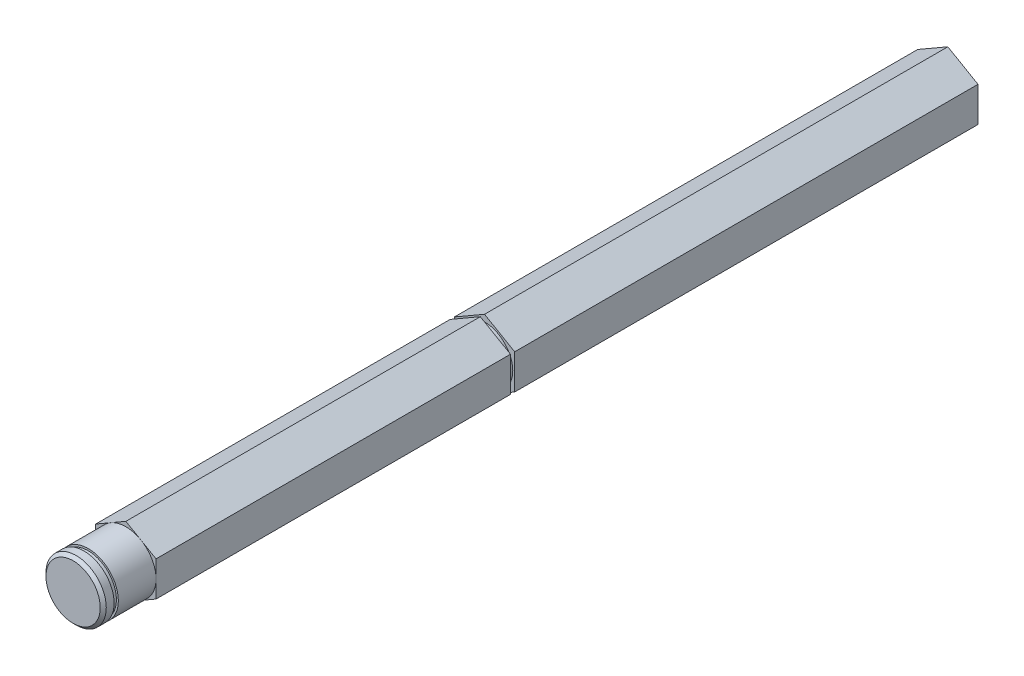
ISO-10303-21;
HEADER;
FILE_DESCRIPTION(('STEP AP214'),'2;1');
FILE_NAME('part.step','',(''),(''),'','','');
FILE_SCHEMA(('AUTOMOTIVE_DESIGN { 1 0 10303 214 1 1 1 1 }'));
ENDSEC;
DATA;
#1=APPLICATION_CONTEXT('core data for automotive mechanical design processes');
#2=APPLICATION_PROTOCOL_DEFINITION('international standard','automotive_design',2000,#1);
#3=PRODUCT_CONTEXT('',#1,'mechanical');
#4=PRODUCT('Part','Part','',(#3));
#5=PRODUCT_RELATED_PRODUCT_CATEGORY('part','',(#4));
#6=PRODUCT_DEFINITION_FORMATION('','',#4);
#7=PRODUCT_DEFINITION_CONTEXT('part definition',#1,'design');
#8=PRODUCT_DEFINITION('design','',#6,#7);
#9=PRODUCT_DEFINITION_SHAPE('','',#8);
#10=(LENGTH_UNIT() NAMED_UNIT(*) SI_UNIT(.MILLI.,.METRE.));
#11=(NAMED_UNIT(*) PLANE_ANGLE_UNIT() SI_UNIT($,.RADIAN.));
#12=(NAMED_UNIT(*) SI_UNIT($,.STERADIAN.) SOLID_ANGLE_UNIT());
#13=UNCERTAINTY_MEASURE_WITH_UNIT(LENGTH_MEASURE(1.E-05),#10,'distance_accuracy_value','');
#14=(GEOMETRIC_REPRESENTATION_CONTEXT(3) GLOBAL_UNCERTAINTY_ASSIGNED_CONTEXT((#13)) GLOBAL_UNIT_ASSIGNED_CONTEXT((#10,
#11,#12)) REPRESENTATION_CONTEXT('',''));
#15=CARTESIAN_POINT('',(0.,0.,0.));
#16=DIRECTION('',(0.,0.,1.));
#17=DIRECTION('',(1.,0.,0.));
#18=AXIS2_PLACEMENT_3D('',#15,#16,#17);
#19=CARTESIAN_POINT('',(6.35,3.66617420935412,184.15));
#20=DIRECTION('',(-0.5,-0.866025403784438,0.));
#21=DIRECTION('',(0.866025403784439,-0.5,0.));
#22=AXIS2_PLACEMENT_3D('',#19,#20,#21);
#23=PLANE('',#22);
#24=DIRECTION('',(-0.866025403784439,0.5,0.));
#25=VECTOR('',#24,1.);
#26=CARTESIAN_POINT('',(6.35,3.66617420935412,97.536));
#27=LINE('',#26,#25);
#28=CARTESIAN_POINT('',(6.35,3.66617420935412,97.536));
#29=VERTEX_POINT('',#28);
#30=CARTESIAN_POINT('',(0.,7.33234841870824,97.536));
#31=VERTEX_POINT('',#30);
#32=EDGE_CURVE('E142',#29,#31,#27,.T.);
#33=ORIENTED_EDGE('',*,*,#32,.F.);
#34=DIRECTION('',(0.,0.,-1.));
#35=VECTOR('',#34,1.);
#36=CARTESIAN_POINT('',(6.35,3.66617420935412,184.15));
#37=LINE('',#36,#35);
#38=CARTESIAN_POINT('',(6.35,3.66617420935412,0.));
#39=VERTEX_POINT('',#38);
#40=EDGE_CURVE('E153',#29,#39,#37,.T.);
#41=ORIENTED_EDGE('',*,*,#40,.T.);
#42=DIRECTION('',(-0.866025403784438,0.5,0.));
#43=VECTOR('',#42,1.);
#44=CARTESIAN_POINT('',(6.35,3.66617420935412,0.));
#45=LINE('',#44,#43);
#46=CARTESIAN_POINT('',(0.,7.33234841870824,0.));
#47=VERTEX_POINT('',#46);
#48=EDGE_CURVE('E254',#39,#47,#45,.T.);
#49=ORIENTED_EDGE('',*,*,#48,.T.);
#50=DIRECTION('',(0.,0.,-1.));
#51=VECTOR('',#50,1.);
#52=CARTESIAN_POINT('',(0.,7.33234841870824,184.15));
#53=LINE('',#52,#51);
#54=EDGE_CURVE('E155',#31,#47,#53,.T.);
#55=ORIENTED_EDGE('',*,*,#54,.F.);
#56=EDGE_LOOP('',(#33,#41,#49,#55));
#57=FACE_BOUND('',#56,.T.);
#58=ADVANCED_FACE('F35',(#57),#23,.F.);
#59=CARTESIAN_POINT('',(0.,7.33234841870824,184.15));
#60=DIRECTION('',(0.5,-0.866025403784439,0.));
#61=DIRECTION('',(0.866025403784439,0.5,0.));
#62=AXIS2_PLACEMENT_3D('',#59,#60,#61);
#63=PLANE('',#62);
#64=DIRECTION('',(-0.866025403784439,-0.5,0.));
#65=VECTOR('',#64,1.);
#66=CARTESIAN_POINT('',(0.,7.33234841870824,97.536));
#67=LINE('',#66,#65);
#68=CARTESIAN_POINT('',(-6.35,3.66617420935412,97.536));
#69=VERTEX_POINT('',#68);
#70=EDGE_CURVE('E157',#31,#69,#67,.T.);
#71=ORIENTED_EDGE('',*,*,#70,.F.);
#72=ORIENTED_EDGE('',*,*,#54,.T.);
#73=DIRECTION('',(-0.866025403784439,-0.5,0.));
#74=VECTOR('',#73,1.);
#75=CARTESIAN_POINT('',(0.,7.33234841870824,0.));
#76=LINE('',#75,#74);
#77=CARTESIAN_POINT('',(-6.35,3.66617420935412,0.));
#78=VERTEX_POINT('',#77);
#79=EDGE_CURVE('E256',#47,#78,#76,.T.);
#80=ORIENTED_EDGE('',*,*,#79,.T.);
#81=DIRECTION('',(0.,0.,-1.));
#82=VECTOR('',#81,1.);
#83=CARTESIAN_POINT('',(-6.35,3.66617420935412,184.15));
#84=LINE('',#83,#82);
#85=EDGE_CURVE('E182',#69,#78,#84,.T.);
#86=ORIENTED_EDGE('',*,*,#85,.F.);
#87=EDGE_LOOP('',(#71,#72,#80,#86));
#88=FACE_BOUND('',#87,.T.);
#89=ADVANCED_FACE('F207',(#88),#63,.F.);
#90=CARTESIAN_POINT('',(-6.35,3.66617420935412,184.15));
#91=DIRECTION('',(1.,0.,0.));
#92=DIRECTION('',(0.,1.,0.));
#93=AXIS2_PLACEMENT_3D('',#90,#91,#92);
#94=PLANE('',#93);
#95=DIRECTION('',(0.,-1.,0.));
#96=VECTOR('',#95,1.);
#97=CARTESIAN_POINT('',(-6.35,3.66617420935412,97.536));
#98=LINE('',#97,#96);
#99=CARTESIAN_POINT('',(-6.35,-3.66617420935412,97.536));
#100=VERTEX_POINT('',#99);
#101=EDGE_CURVE('E276',#69,#100,#98,.T.);
#102=ORIENTED_EDGE('',*,*,#101,.F.);
#103=ORIENTED_EDGE('',*,*,#85,.T.);
#104=DIRECTION('',(0.,-1.,0.));
#105=VECTOR('',#104,1.);
#106=CARTESIAN_POINT('',(-6.35,3.66617420935412,0.));
#107=LINE('',#106,#105);
#108=CARTESIAN_POINT('',(-6.35,-3.66617420935412,0.));
#109=VERTEX_POINT('',#108);
#110=EDGE_CURVE('E259',#78,#109,#107,.T.);
#111=ORIENTED_EDGE('',*,*,#110,.T.);
#112=DIRECTION('',(0.,0.,-1.));
#113=VECTOR('',#112,1.);
#114=CARTESIAN_POINT('',(-6.35,-3.66617420935412,184.15));
#115=LINE('',#114,#113);
#116=EDGE_CURVE('E178',#100,#109,#115,.T.);
#117=ORIENTED_EDGE('',*,*,#116,.F.);
#118=EDGE_LOOP('',(#102,#103,#111,#117));
#119=FACE_BOUND('',#118,.T.);
#120=ADVANCED_FACE('F212',(#119),#94,.F.);
#121=CARTESIAN_POINT('',(-6.35,-3.66617420935412,184.15));
#122=DIRECTION('',(0.5,0.866025403784438,0.));
#123=DIRECTION('',(-0.866025403784438,0.5,0.));
#124=AXIS2_PLACEMENT_3D('',#121,#122,#123);
#125=PLANE('',#124);
#126=DIRECTION('',(0.866025403784438,-0.5,0.));
#127=VECTOR('',#126,1.);
#128=CARTESIAN_POINT('',(-6.35,-3.66617420935412,97.536));
#129=LINE('',#128,#127);
#130=CARTESIAN_POINT('',(0.,-7.33234841870824,97.536));
#131=VERTEX_POINT('',#130);
#132=EDGE_CURVE('E278',#100,#131,#129,.T.);
#133=ORIENTED_EDGE('',*,*,#132,.F.);
#134=ORIENTED_EDGE('',*,*,#116,.T.);
#135=DIRECTION('',(0.866025403784438,-0.5,0.));
#136=VECTOR('',#135,1.);
#137=CARTESIAN_POINT('',(-6.35,-3.66617420935412,0.));
#138=LINE('',#137,#136);
#139=CARTESIAN_POINT('',(0.,-7.33234841870824,0.));
#140=VERTEX_POINT('',#139);
#141=EDGE_CURVE('E262',#109,#140,#138,.T.);
#142=ORIENTED_EDGE('',*,*,#141,.T.);
#143=DIRECTION('',(0.,0.,-1.));
#144=VECTOR('',#143,1.);
#145=CARTESIAN_POINT('',(0.,-7.33234841870824,184.15));
#146=LINE('',#145,#144);
#147=EDGE_CURVE('E174',#131,#140,#146,.T.);
#148=ORIENTED_EDGE('',*,*,#147,.F.);
#149=EDGE_LOOP('',(#133,#134,#142,#148));
#150=FACE_BOUND('',#149,.T.);
#151=ADVANCED_FACE('F362',(#150),#125,.F.);
#152=CARTESIAN_POINT('',(0.,-7.33234841870824,184.15));
#153=DIRECTION('',(-0.5,0.866025403784439,0.));
#154=DIRECTION('',(-0.866025403784439,-0.5,0.));
#155=AXIS2_PLACEMENT_3D('',#152,#153,#154);
#156=PLANE('',#155);
#157=DIRECTION('',(0.866025403784439,0.5,0.));
#158=VECTOR('',#157,1.);
#159=CARTESIAN_POINT('',(0.,-7.33234841870824,97.536));
#160=LINE('',#159,#158);
#161=CARTESIAN_POINT('',(6.35,-3.66617420935412,97.536));
#162=VERTEX_POINT('',#161);
#163=EDGE_CURVE('E58',#131,#162,#160,.T.);
#164=ORIENTED_EDGE('',*,*,#163,.F.);
#165=ORIENTED_EDGE('',*,*,#147,.T.);
#166=DIRECTION('',(0.866025403784439,0.5,0.));
#167=VECTOR('',#166,1.);
#168=CARTESIAN_POINT('',(0.,-7.33234841870824,0.));
#169=LINE('',#168,#167);
#170=CARTESIAN_POINT('',(6.35,-3.66617420935412,0.));
#171=VERTEX_POINT('',#170);
#172=EDGE_CURVE('E167',#140,#171,#169,.T.);
#173=ORIENTED_EDGE('',*,*,#172,.T.);
#174=DIRECTION('',(0.,0.,-1.));
#175=VECTOR('',#174,1.);
#176=CARTESIAN_POINT('',(6.35,-3.66617420935412,184.15));
#177=LINE('',#176,#175);
#178=EDGE_CURVE('E166',#162,#171,#177,.T.);
#179=ORIENTED_EDGE('',*,*,#178,.F.);
#180=EDGE_LOOP('',(#164,#165,#173,#179));
#181=FACE_BOUND('',#180,.T.);
#182=ADVANCED_FACE('F267',(#181),#156,.F.);
#183=CARTESIAN_POINT('',(6.35,-3.66617420935412,184.15));
#184=DIRECTION('',(-1.,0.,0.));
#185=DIRECTION('',(0.,-1.,0.));
#186=AXIS2_PLACEMENT_3D('',#183,#184,#185);
#187=PLANE('',#186);
#188=DIRECTION('',(0.,1.,0.));
#189=VECTOR('',#188,1.);
#190=CARTESIAN_POINT('',(6.35,-3.66617420935412,97.536));
#191=LINE('',#190,#189);
#192=EDGE_CURVE('E139',#162,#29,#191,.T.);
#193=ORIENTED_EDGE('',*,*,#192,.F.);
#194=ORIENTED_EDGE('',*,*,#178,.T.);
#195=DIRECTION('',(0.,1.,0.));
#196=VECTOR('',#195,1.);
#197=CARTESIAN_POINT('',(6.35,-3.66617420935412,0.));
#198=LINE('',#197,#196);
#199=EDGE_CURVE('E161',#171,#39,#198,.T.);
#200=ORIENTED_EDGE('',*,*,#199,.T.);
#201=ORIENTED_EDGE('',*,*,#40,.F.);
#202=EDGE_LOOP('',(#193,#194,#200,#201));
#203=FACE_BOUND('',#202,.T.);
#204=ADVANCED_FACE('F159',(#203),#187,.F.);
#205=CARTESIAN_POINT('',(0.,0.,0.));
#206=DIRECTION('',(0.,0.,1.));
#207=DIRECTION('',(1.,0.,0.));
#208=AXIS2_PLACEMENT_3D('',#205,#206,#207);
#209=PLANE('',#208);
#210=ORIENTED_EDGE('',*,*,#48,.F.);
#211=ORIENTED_EDGE('',*,*,#199,.F.);
#212=ORIENTED_EDGE('',*,*,#172,.F.);
#213=ORIENTED_EDGE('',*,*,#141,.F.);
#214=ORIENTED_EDGE('',*,*,#110,.F.);
#215=ORIENTED_EDGE('',*,*,#79,.F.);
#216=EDGE_LOOP('',(#210,#211,#212,#213,#214,#215));
#217=FACE_BOUND('',#216,.T.);
#218=ADVANCED_FACE('F271',(#217),#209,.F.);
#219=CARTESIAN_POINT('',(0.,8.98167780774194,98.425));
#220=DIRECTION('',(0.,0.,-1.));
#221=DIRECTION('',(-1.,0.,0.));
#222=AXIS2_PLACEMENT_3D('',#219,#220,#221);
#223=PLANE('',#222);
#224=CARTESIAN_POINT('',(0.,0.,98.425));
#225=DIRECTION('',(0.,0.,1.));
#226=DIRECTION('',(1.,0.,0.));
#227=AXIS2_PLACEMENT_3D('',#224,#225,#226);
#228=CIRCLE('',#227,5.9436);
#229=CARTESIAN_POINT('',(5.9436,0.,98.425));
#230=VERTEX_POINT('',#229);
#231=EDGE_CURVE('E377',#230,#230,#228,.T.);
#232=ORIENTED_EDGE('',*,*,#231,.T.);
#233=EDGE_LOOP('',(#232));
#234=FACE_BOUND('',#233,.T.);
#235=DIRECTION('',(0.866025403784439,-0.5,0.));
#236=VECTOR('',#235,1.);
#237=CARTESIAN_POINT('',(6.35,3.66617420935412,98.425));
#238=LINE('',#237,#236);
#239=CARTESIAN_POINT('',(0.,7.33234841870824,98.425));
#240=VERTEX_POINT('',#239);
#241=CARTESIAN_POINT('',(6.35,3.66617420935412,98.425));
#242=VERTEX_POINT('',#241);
#243=EDGE_CURVE('E50',#240,#242,#238,.T.);
#244=ORIENTED_EDGE('',*,*,#243,.T.);
#245=DIRECTION('',(0.,-1.,0.));
#246=VECTOR('',#245,1.);
#247=CARTESIAN_POINT('',(6.35,-3.66617420935412,98.425));
#248=LINE('',#247,#246);
#249=CARTESIAN_POINT('',(6.35,-3.66617420935412,98.425));
#250=VERTEX_POINT('',#249);
#251=EDGE_CURVE('E147',#242,#250,#248,.T.);
#252=ORIENTED_EDGE('',*,*,#251,.T.);
#253=DIRECTION('',(-0.866025403784439,-0.5,0.));
#254=VECTOR('',#253,1.);
#255=CARTESIAN_POINT('',(0.,-7.33234841870824,98.425));
#256=LINE('',#255,#254);
#257=CARTESIAN_POINT('',(0.,-7.33234841870824,98.425));
#258=VERTEX_POINT('',#257);
#259=EDGE_CURVE('E156',#250,#258,#256,.T.);
#260=ORIENTED_EDGE('',*,*,#259,.T.);
#261=DIRECTION('',(-0.866025403784438,0.5,0.));
#262=VECTOR('',#261,1.);
#263=CARTESIAN_POINT('',(-6.35,-3.66617420935412,98.425));
#264=LINE('',#263,#262);
#265=CARTESIAN_POINT('',(-6.35,-3.66617420935412,98.425));
#266=VERTEX_POINT('',#265);
#267=EDGE_CURVE('E283',#258,#266,#264,.T.);
#268=ORIENTED_EDGE('',*,*,#267,.T.);
#269=DIRECTION('',(0.,1.,0.));
#270=VECTOR('',#269,1.);
#271=CARTESIAN_POINT('',(-6.35,3.66617420935412,98.425));
#272=LINE('',#271,#270);
#273=CARTESIAN_POINT('',(-6.35,3.66617420935412,98.425));
#274=VERTEX_POINT('',#273);
#275=EDGE_CURVE('E285',#266,#274,#272,.T.);
#276=ORIENTED_EDGE('',*,*,#275,.T.);
#277=DIRECTION('',(0.866025403784439,0.5,0.));
#278=VECTOR('',#277,1.);
#279=CARTESIAN_POINT('',(0.,7.33234841870824,98.425));
#280=LINE('',#279,#278);
#281=EDGE_CURVE('E234',#274,#240,#280,.T.);
#282=ORIENTED_EDGE('',*,*,#281,.T.);
#283=EDGE_LOOP('',(#244,#252,#260,#268,#276,#282));
#284=FACE_BOUND('',#283,.T.);
#285=ADVANCED_FACE('F338',(#234,#284),#223,.T.);
#286=CARTESIAN_POINT('',(0.,8.98167780774194,97.536));
#287=DIRECTION('',(0.,0.,1.));
#288=DIRECTION('',(1.,0.,0.));
#289=AXIS2_PLACEMENT_3D('',#286,#287,#288);
#290=PLANE('',#289);
#291=CARTESIAN_POINT('',(0.,0.,97.536));
#292=DIRECTION('',(0.,0.,1.));
#293=DIRECTION('',(1.,0.,0.));
#294=AXIS2_PLACEMENT_3D('',#291,#292,#293);
#295=CIRCLE('',#294,5.9436);
#296=CARTESIAN_POINT('',(5.9436,0.,97.536));
#297=VERTEX_POINT('',#296);
#298=EDGE_CURVE('E380',#297,#297,#295,.T.);
#299=ORIENTED_EDGE('',*,*,#298,.F.);
#300=EDGE_LOOP('',(#299));
#301=FACE_BOUND('',#300,.T.);
#302=ORIENTED_EDGE('',*,*,#32,.T.);
#303=ORIENTED_EDGE('',*,*,#70,.T.);
#304=ORIENTED_EDGE('',*,*,#101,.T.);
#305=ORIENTED_EDGE('',*,*,#132,.T.);
#306=ORIENTED_EDGE('',*,*,#163,.T.);
#307=ORIENTED_EDGE('',*,*,#192,.T.);
#308=EDGE_LOOP('',(#302,#303,#304,#305,#306,#307));
#309=FACE_BOUND('',#308,.T.);
#310=ADVANCED_FACE('F141',(#301,#309),#290,.T.);
#311=CARTESIAN_POINT('',(0.,0.,184.15));
#312=DIRECTION('',(0.,0.,1.));
#313=DIRECTION('',(1.,0.,0.));
#314=AXIS2_PLACEMENT_3D('',#311,#312,#313);
#315=CYLINDRICAL_SURFACE('',#314,5.9436);
#316=ORIENTED_EDGE('',*,*,#298,.T.);
#317=EDGE_LOOP('',(#316));
#318=FACE_BOUND('',#317,.T.);
#319=ORIENTED_EDGE('',*,*,#231,.F.);
#320=EDGE_LOOP('',(#319));
#321=FACE_BOUND('',#320,.T.);
#322=ADVANCED_FACE('F346',(#318,#321),#315,.T.);
#323=CARTESIAN_POINT('',(0.,0.,173.0375));
#324=DIRECTION('',(0.,0.,1.));
#325=DIRECTION('',(1.,0.,0.));
#326=AXIS2_PLACEMENT_3D('',#323,#324,#325);
#327=PLANE('',#326);
#328=DIRECTION('',(0.866025403784439,0.5,0.));
#329=VECTOR('',#328,1.);
#330=CARTESIAN_POINT('',(0.,-7.33234841870824,173.0375));
#331=LINE('',#330,#329);
#332=CARTESIAN_POINT('',(3.175,-5.49926131403118,173.0375));
#333=VERTEX_POINT('',#332);
#334=CARTESIAN_POINT('',(6.35,-3.66617420935412,173.0375));
#335=VERTEX_POINT('',#334);
#336=EDGE_CURVE('E291',#333,#335,#331,.T.);
#337=ORIENTED_EDGE('',*,*,#336,.T.);
#338=DIRECTION('',(0.,1.,0.));
#339=VECTOR('',#338,1.);
#340=CARTESIAN_POINT('',(6.35,-3.66617420935412,173.0375));
#341=LINE('',#340,#339);
#342=CARTESIAN_POINT('',(6.35,0.,173.0375));
#343=VERTEX_POINT('',#342);
#344=EDGE_CURVE('E148',#335,#343,#341,.T.);
#345=ORIENTED_EDGE('',*,*,#344,.T.);
#346=CARTESIAN_POINT('',(0.,0.,173.0375));
#347=DIRECTION('',(0.,0.,1.));
#348=DIRECTION('',(1.,0.,0.));
#349=AXIS2_PLACEMENT_3D('',#346,#347,#348);
#350=CIRCLE('',#349,6.35);
#351=EDGE_CURVE('E233',#333,#343,#350,.T.);
#352=ORIENTED_EDGE('',*,*,#351,.F.);
#353=EDGE_LOOP('',(#337,#345,#352));
#354=FACE_BOUND('',#353,.T.);
#355=ADVANCED_FACE('F226',(#354),#327,.T.);
#356=DIRECTION('',(0.866025403784438,-0.5,0.));
#357=VECTOR('',#356,1.);
#358=CARTESIAN_POINT('',(-6.35,-3.66617420935412,173.0375));
#359=LINE('',#358,#357);
#360=CARTESIAN_POINT('',(-3.175,-5.49926131403118,173.0375));
#361=VERTEX_POINT('',#360);
#362=CARTESIAN_POINT('',(0.,-7.33234841870824,173.0375));
#363=VERTEX_POINT('',#362);
#364=EDGE_CURVE('E294',#361,#363,#359,.T.);
#365=ORIENTED_EDGE('',*,*,#364,.T.);
#366=EDGE_CURVE('E293',#363,#333,#331,.T.);
#367=ORIENTED_EDGE('',*,*,#366,.T.);
#368=EDGE_CURVE('E303',#361,#333,#350,.T.);
#369=ORIENTED_EDGE('',*,*,#368,.F.);
#370=EDGE_LOOP('',(#365,#367,#369));
#371=FACE_BOUND('',#370,.T.);
#372=ADVANCED_FACE('F301',(#371),#327,.T.);
#373=DIRECTION('',(0.,-1.,0.));
#374=VECTOR('',#373,1.);
#375=CARTESIAN_POINT('',(-6.35,3.66617420935412,173.0375));
#376=LINE('',#375,#374);
#377=CARTESIAN_POINT('',(-6.35,0.,173.0375));
#378=VERTEX_POINT('',#377);
#379=CARTESIAN_POINT('',(-6.35,-3.66617420935412,173.0375));
#380=VERTEX_POINT('',#379);
#381=EDGE_CURVE('E251',#378,#380,#376,.T.);
#382=ORIENTED_EDGE('',*,*,#381,.T.);
#383=EDGE_CURVE('E295',#380,#361,#359,.T.);
#384=ORIENTED_EDGE('',*,*,#383,.T.);
#385=EDGE_CURVE('E317',#378,#361,#350,.T.);
#386=ORIENTED_EDGE('',*,*,#385,.F.);
#387=EDGE_LOOP('',(#382,#384,#386));
#388=FACE_BOUND('',#387,.T.);
#389=ADVANCED_FACE('F334',(#388),#327,.T.);
#390=DIRECTION('',(-0.866025403784439,-0.5,0.));
#391=VECTOR('',#390,1.);
#392=CARTESIAN_POINT('',(0.,7.33234841870824,173.0375));
#393=LINE('',#392,#391);
#394=CARTESIAN_POINT('',(-3.175,5.49926131403118,173.0375));
#395=VERTEX_POINT('',#394);
#396=CARTESIAN_POINT('',(-6.35,3.66617420935412,173.0375));
#397=VERTEX_POINT('',#396);
#398=EDGE_CURVE('E241',#395,#397,#393,.T.);
#399=ORIENTED_EDGE('',*,*,#398,.T.);
#400=EDGE_CURVE('E249',#397,#378,#376,.T.);
#401=ORIENTED_EDGE('',*,*,#400,.T.);
#402=EDGE_CURVE('E324',#395,#378,#350,.T.);
#403=ORIENTED_EDGE('',*,*,#402,.F.);
#404=EDGE_LOOP('',(#399,#401,#403));
#405=FACE_BOUND('',#404,.T.);
#406=ADVANCED_FACE('F333',(#405),#327,.T.);
#407=DIRECTION('',(-0.866025403784439,0.5,0.));
#408=VECTOR('',#407,1.);
#409=CARTESIAN_POINT('',(6.35,3.66617420935412,173.0375));
#410=LINE('',#409,#408);
#411=CARTESIAN_POINT('',(3.175,5.49926131403118,173.0375));
#412=VERTEX_POINT('',#411);
#413=CARTESIAN_POINT('',(0.,7.33234841870825,173.0375));
#414=VERTEX_POINT('',#413);
#415=EDGE_CURVE('E245',#412,#414,#410,.T.);
#416=ORIENTED_EDGE('',*,*,#415,.T.);
#417=EDGE_CURVE('E240',#414,#395,#393,.T.);
#418=ORIENTED_EDGE('',*,*,#417,.T.);
#419=EDGE_CURVE('E292',#412,#395,#350,.T.);
#420=ORIENTED_EDGE('',*,*,#419,.F.);
#421=EDGE_LOOP('',(#416,#418,#420));
#422=FACE_BOUND('',#421,.T.);
#423=ADVANCED_FACE('F225',(#422),#327,.T.);
#424=ORIENTED_EDGE('',*,*,#251,.F.);
#425=CARTESIAN_POINT('',(6.35,3.66617420935412,173.0375));
#426=VERTEX_POINT('',#425);
#427=EDGE_CURVE('E163',#426,#242,#37,.T.);
#428=ORIENTED_EDGE('',*,*,#427,.F.);
#429=EDGE_CURVE('E189',#343,#426,#341,.T.);
#430=ORIENTED_EDGE('',*,*,#429,.F.);
#431=ORIENTED_EDGE('',*,*,#344,.F.);
#432=EDGE_CURVE('E171',#335,#250,#177,.T.);
#433=ORIENTED_EDGE('',*,*,#432,.T.);
#434=EDGE_LOOP('',(#424,#428,#430,#431,#433));
#435=FACE_BOUND('',#434,.T.);
#436=ADVANCED_FACE('F322',(#435),#187,.F.);
#437=ORIENTED_EDGE('',*,*,#259,.F.);
#438=ORIENTED_EDGE('',*,*,#432,.F.);
#439=ORIENTED_EDGE('',*,*,#336,.F.);
#440=ORIENTED_EDGE('',*,*,#366,.F.);
#441=EDGE_CURVE('E175',#363,#258,#146,.T.);
#442=ORIENTED_EDGE('',*,*,#441,.T.);
#443=EDGE_LOOP('',(#437,#438,#439,#440,#442));
#444=FACE_BOUND('',#443,.T.);
#445=ADVANCED_FACE('F320',(#444),#156,.F.);
#446=ORIENTED_EDGE('',*,*,#267,.F.);
#447=ORIENTED_EDGE('',*,*,#441,.F.);
#448=ORIENTED_EDGE('',*,*,#364,.F.);
#449=ORIENTED_EDGE('',*,*,#383,.F.);
#450=EDGE_CURVE('E179',#380,#266,#115,.T.);
#451=ORIENTED_EDGE('',*,*,#450,.T.);
#452=EDGE_LOOP('',(#446,#447,#448,#449,#451));
#453=FACE_BOUND('',#452,.T.);
#454=ADVANCED_FACE('F337',(#453),#125,.F.);
#455=ORIENTED_EDGE('',*,*,#275,.F.);
#456=ORIENTED_EDGE('',*,*,#450,.F.);
#457=ORIENTED_EDGE('',*,*,#381,.F.);
#458=ORIENTED_EDGE('',*,*,#400,.F.);
#459=EDGE_CURVE('E183',#397,#274,#84,.T.);
#460=ORIENTED_EDGE('',*,*,#459,.T.);
#461=EDGE_LOOP('',(#455,#456,#457,#458,#460));
#462=FACE_BOUND('',#461,.T.);
#463=ADVANCED_FACE('F227',(#462),#94,.F.);
#464=ORIENTED_EDGE('',*,*,#281,.F.);
#465=ORIENTED_EDGE('',*,*,#459,.F.);
#466=ORIENTED_EDGE('',*,*,#398,.F.);
#467=ORIENTED_EDGE('',*,*,#417,.F.);
#468=EDGE_CURVE('E186',#414,#240,#53,.T.);
#469=ORIENTED_EDGE('',*,*,#468,.T.);
#470=EDGE_LOOP('',(#464,#465,#466,#467,#469));
#471=FACE_BOUND('',#470,.T.);
#472=ADVANCED_FACE('F215',(#471),#63,.F.);
#473=ORIENTED_EDGE('',*,*,#243,.F.);
#474=ORIENTED_EDGE('',*,*,#468,.F.);
#475=ORIENTED_EDGE('',*,*,#415,.F.);
#476=EDGE_CURVE('E247',#426,#412,#410,.T.);
#477=ORIENTED_EDGE('',*,*,#476,.F.);
#478=ORIENTED_EDGE('',*,*,#427,.T.);
#479=EDGE_LOOP('',(#473,#474,#475,#477,#478));
#480=FACE_BOUND('',#479,.T.);
#481=ADVANCED_FACE('F208',(#480),#23,.F.);
#482=ORIENTED_EDGE('',*,*,#476,.T.);
#483=EDGE_CURVE('E288',#343,#412,#350,.T.);
#484=ORIENTED_EDGE('',*,*,#483,.F.);
#485=ORIENTED_EDGE('',*,*,#429,.T.);
#486=EDGE_LOOP('',(#482,#484,#485));
#487=FACE_BOUND('',#486,.T.);
#488=ADVANCED_FACE('F217',(#487),#327,.T.);
#489=CARTESIAN_POINT('',(0.,0.,173.0375));
#490=DIRECTION('',(0.,0.,1.));
#491=DIRECTION('',(1.,0.,0.));
#492=AXIS2_PLACEMENT_3D('',#489,#490,#491);
#493=CYLINDRICAL_SURFACE('',#492,6.35);
#494=ORIENTED_EDGE('',*,*,#483,.T.);
#495=ORIENTED_EDGE('',*,*,#419,.T.);
#496=ORIENTED_EDGE('',*,*,#402,.T.);
#497=ORIENTED_EDGE('',*,*,#385,.T.);
#498=ORIENTED_EDGE('',*,*,#368,.T.);
#499=ORIENTED_EDGE('',*,*,#351,.T.);
#500=EDGE_LOOP('',(#494,#495,#496,#497,#498,#499));
#501=FACE_BOUND('',#500,.T.);
#502=CARTESIAN_POINT('',(0.,0.,180.975));
#503=DIRECTION('',(0.,0.,1.));
#504=DIRECTION('',(1.,0.,0.));
#505=AXIS2_PLACEMENT_3D('',#502,#503,#504);
#506=CIRCLE('',#505,6.35);
#507=CARTESIAN_POINT('',(6.35,0.,180.975));
#508=VERTEX_POINT('',#507);
#509=EDGE_CURVE('E388',#508,#508,#506,.T.);
#510=ORIENTED_EDGE('',*,*,#509,.F.);
#511=EDGE_LOOP('',(#510));
#512=FACE_BOUND('',#511,.T.);
#513=ADVANCED_FACE('F204',(#501,#512),#493,.T.);
#514=CARTESIAN_POINT('',(0.,6.35,181.864));
#515=DIRECTION('',(0.,0.,-1.));
#516=DIRECTION('',(-1.,0.,0.));
#517=AXIS2_PLACEMENT_3D('',#514,#515,#516);
#518=PLANE('',#517);
#519=CARTESIAN_POINT('',(0.,0.,181.864));
#520=DIRECTION('',(0.,0.,1.));
#521=DIRECTION('',(1.,0.,0.));
#522=AXIS2_PLACEMENT_3D('',#519,#520,#521);
#523=CIRCLE('',#522,5.9436);
#524=CARTESIAN_POINT('',(5.9436,0.,181.864));
#525=VERTEX_POINT('',#524);
#526=EDGE_CURVE('E374',#525,#525,#523,.T.);
#527=ORIENTED_EDGE('',*,*,#526,.T.);
#528=EDGE_LOOP('',(#527));
#529=FACE_BOUND('',#528,.T.);
#530=CARTESIAN_POINT('',(0.,0.,181.864));
#531=DIRECTION('',(0.,0.,1.));
#532=DIRECTION('',(1.,0.,0.));
#533=AXIS2_PLACEMENT_3D('',#530,#531,#532);
#534=CIRCLE('',#533,6.35);
#535=CARTESIAN_POINT('',(6.35,0.,181.864));
#536=VERTEX_POINT('',#535);
#537=EDGE_CURVE('E379',#536,#536,#534,.T.);
#538=ORIENTED_EDGE('',*,*,#537,.F.);
#539=EDGE_LOOP('',(#538));
#540=FACE_BOUND('',#539,.T.);
#541=ADVANCED_FACE('F395',(#529,#540),#518,.T.);
#542=CARTESIAN_POINT('',(0.,0.,184.15));
#543=DIRECTION('',(0.,0.,1.));
#544=DIRECTION('',(1.,0.,0.));
#545=AXIS2_PLACEMENT_3D('',#542,#543,#544);
#546=CYLINDRICAL_SURFACE('',#545,5.9436);
#547=CARTESIAN_POINT('',(0.,0.,180.975));
#548=DIRECTION('',(0.,0.,1.));
#549=DIRECTION('',(1.,0.,0.));
#550=AXIS2_PLACEMENT_3D('',#547,#548,#549);
#551=CIRCLE('',#550,5.9436);
#552=CARTESIAN_POINT('',(5.9436,0.,180.975));
#553=VERTEX_POINT('',#552);
#554=EDGE_CURVE('E385',#553,#553,#551,.T.);
#555=ORIENTED_EDGE('',*,*,#554,.T.);
#556=EDGE_LOOP('',(#555));
#557=FACE_BOUND('',#556,.T.);
#558=ORIENTED_EDGE('',*,*,#526,.F.);
#559=EDGE_LOOP('',(#558));
#560=FACE_BOUND('',#559,.T.);
#561=ADVANCED_FACE('F397',(#557,#560),#546,.T.);
#562=CARTESIAN_POINT('',(0.,6.35,180.975));
#563=DIRECTION('',(0.,0.,1.));
#564=DIRECTION('',(1.,0.,0.));
#565=AXIS2_PLACEMENT_3D('',#562,#563,#564);
#566=PLANE('',#565);
#567=ORIENTED_EDGE('',*,*,#509,.T.);
#568=EDGE_LOOP('',(#567));
#569=FACE_BOUND('',#568,.T.);
#570=ORIENTED_EDGE('',*,*,#554,.F.);
#571=EDGE_LOOP('',(#570));
#572=FACE_BOUND('',#571,.T.);
#573=ADVANCED_FACE('F354',(#569,#572),#566,.T.);
#574=CARTESIAN_POINT('',(0.,0.,184.15));
#575=DIRECTION('',(0.,0.,1.));
#576=DIRECTION('',(1.,0.,0.));
#577=AXIS2_PLACEMENT_3D('',#574,#575,#576);
#578=PLANE('',#577);
#579=CARTESIAN_POINT('',(0.,0.,184.15));
#580=DIRECTION('',(0.,0.,1.));
#581=DIRECTION('',(1.,0.,0.));
#582=AXIS2_PLACEMENT_3D('',#579,#580,#581);
#583=CIRCLE('',#582,5.715);
#584=CARTESIAN_POINT('',(5.715,0.,184.15));
#585=VERTEX_POINT('',#584);
#586=EDGE_CURVE('E43',#585,#585,#583,.T.);
#587=ORIENTED_EDGE('',*,*,#586,.T.);
#588=EDGE_LOOP('',(#587));
#589=FACE_BOUND('',#588,.T.);
#590=ADVANCED_FACE('F194',(#589),#578,.T.);
#591=CARTESIAN_POINT('',(0.,0.,183.515));
#592=DIRECTION('',(0.,0.,1.));
#593=DIRECTION('',(1.,0.,0.));
#594=AXIS2_PLACEMENT_3D('',#591,#592,#593);
#595=CIRCLE('',#594,6.35);
#596=CARTESIAN_POINT('',(6.35,0.,183.515));
#597=VERTEX_POINT('',#596);
#598=EDGE_CURVE('E11',#597,#597,#595,.F.);
#599=ORIENTED_EDGE('',*,*,#598,.T.);
#600=EDGE_LOOP('',(#599));
#601=FACE_BOUND('',#600,.T.);
#602=ORIENTED_EDGE('',*,*,#537,.T.);
#603=EDGE_LOOP('',(#602));
#604=FACE_BOUND('',#603,.T.);
#605=ADVANCED_FACE('F197',(#601,#604),#493,.T.);
#606=CARTESIAN_POINT('',(0.,0.,184.15));
#607=DIRECTION('',(0.,0.,-1.));
#608=DIRECTION('',(-1.,0.,0.));
#609=AXIS2_PLACEMENT_3D('',#606,#607,#608);
#610=CONICAL_SURFACE('',#609,5.715,0.785398163397471);
#611=ORIENTED_EDGE('',*,*,#598,.F.);
#612=EDGE_LOOP('',(#611));
#613=FACE_BOUND('',#612,.T.);
#614=ORIENTED_EDGE('',*,*,#586,.F.);
#615=EDGE_LOOP('',(#614));
#616=FACE_BOUND('',#615,.T.);
#617=ADVANCED_FACE('F37',(#613,#616),#610,.T.);
#618=CLOSED_SHELL('',(#58,#89,#120,#151,#182,#204,#218,#285,#310,#322,#355,#372,#389,#406,#423,
#436,#445,#454,#463,#472,#481,#488,#513,#541,#561,#573,#590,#605,#617));
#619=MANIFOLD_SOLID_BREP('B2',#618);
#620=ADVANCED_BREP_SHAPE_REPRESENTATION('',(#18,#619),#14);
#621=SHAPE_DEFINITION_REPRESENTATION(#9,#620);
ENDSEC;
END-ISO-10303-21;
